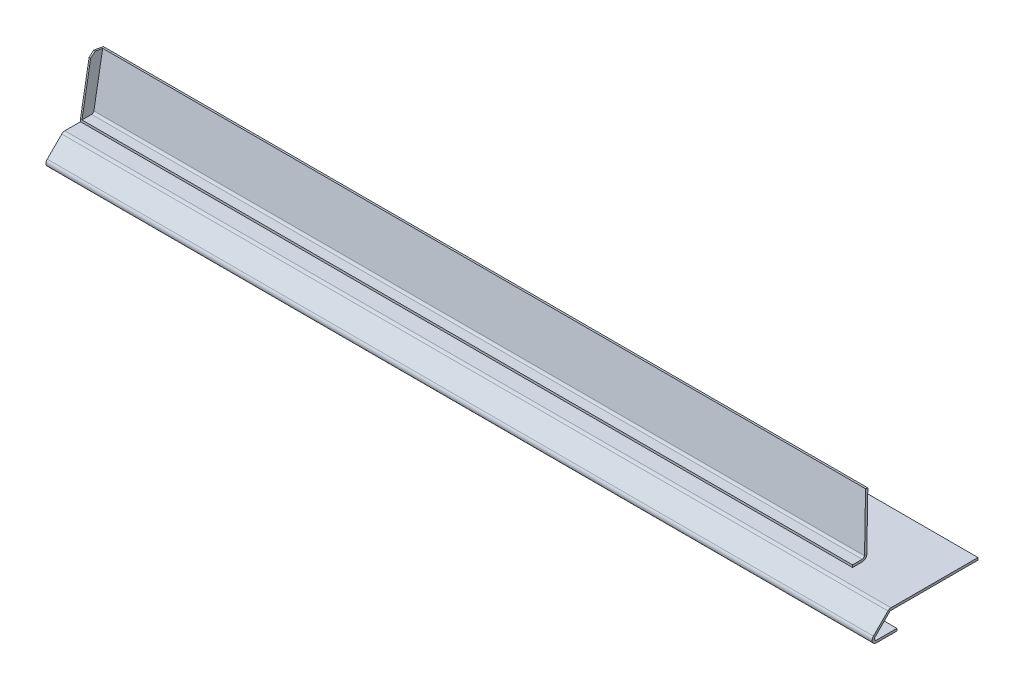
ISO-10303-21;
HEADER;
FILE_DESCRIPTION(('STEP AP214'),'2;1');
FILE_NAME('part.step','',(''),(''),'','','');
FILE_SCHEMA(('AUTOMOTIVE_DESIGN { 1 0 10303 214 1 1 1 1 }'));
ENDSEC;
DATA;
#1=APPLICATION_CONTEXT('core data for automotive mechanical design processes');
#2=APPLICATION_PROTOCOL_DEFINITION('international standard','automotive_design',2000,#1);
#3=PRODUCT_CONTEXT('',#1,'mechanical');
#4=PRODUCT('Part','Part','',(#3));
#5=PRODUCT_RELATED_PRODUCT_CATEGORY('part','',(#4));
#6=PRODUCT_DEFINITION_FORMATION('','',#4);
#7=PRODUCT_DEFINITION_CONTEXT('part definition',#1,'design');
#8=PRODUCT_DEFINITION('design','',#6,#7);
#9=PRODUCT_DEFINITION_SHAPE('','',#8);
#10=(LENGTH_UNIT() NAMED_UNIT(*) SI_UNIT(.MILLI.,.METRE.));
#11=(NAMED_UNIT(*) PLANE_ANGLE_UNIT() SI_UNIT($,.RADIAN.));
#12=(NAMED_UNIT(*) SI_UNIT($,.STERADIAN.) SOLID_ANGLE_UNIT());
#13=UNCERTAINTY_MEASURE_WITH_UNIT(LENGTH_MEASURE(1.E-05),#10,'distance_accuracy_value','');
#14=(GEOMETRIC_REPRESENTATION_CONTEXT(3) GLOBAL_UNCERTAINTY_ASSIGNED_CONTEXT((#13)) GLOBAL_UNIT_ASSIGNED_CONTEXT((#10,
#11,#12)) REPRESENTATION_CONTEXT('',''));
#15=CARTESIAN_POINT('',(0.,0.,0.));
#16=DIRECTION('',(0.,0.,1.));
#17=DIRECTION('',(1.,0.,0.));
#18=AXIS2_PLACEMENT_3D('',#15,#16,#17);
#19=CARTESIAN_POINT('',(-475.,146.5,-26.6));
#20=DIRECTION('',(1.,0.,0.));
#21=DIRECTION('',(0.,0.,1.));
#22=AXIS2_PLACEMENT_3D('',#19,#20,#21);
#23=PLANE('',#22);
#24=DIRECTION('',(0.,-0.984807753012213,0.173648177666903));
#25=VECTOR('',#24,1.);
#26=CARTESIAN_POINT('',(-475.,-824.0540173282,410.745576741));
#27=LINE('',#26,#25);
#28=CARTESIAN_POINT('',(-475.,-824.0540173282,410.745576741));
#29=VERTEX_POINT('',#28);
#30=CARTESIAN_POINT('',(-475.,-888.541889066,422.1165284568));
#31=VERTEX_POINT('',#30);
#32=EDGE_CURVE('E11',#29,#31,#27,.T.);
#33=ORIENTED_EDGE('',*,*,#32,.T.);
#34=CARTESIAN_POINT('',(-475.,-887.5,428.0253749749));
#35=DIRECTION('',(-1.,0.,0.));
#36=DIRECTION('',(0.,-0.173648177666903,-0.984807753012213));
#37=AXIS2_PLACEMENT_3D('',#34,#35,#36);
#38=CIRCLE('',#37,6.);
#39=CARTESIAN_POINT('',(-475.,-893.5,428.0253749749));
#40=VERTEX_POINT('',#39);
#41=EDGE_CURVE('E26',#31,#40,#38,.T.);
#42=ORIENTED_EDGE('',*,*,#41,.T.);
#43=DIRECTION('',(0.,0.,1.));
#44=VECTOR('',#43,1.);
#45=CARTESIAN_POINT('',(-475.,-893.5,348.045));
#46=LINE('',#45,#44);
#47=CARTESIAN_POINT('',(-475.,-893.5,348.045));
#48=VERTEX_POINT('',#47);
#49=EDGE_CURVE('E199',#48,#40,#46,.T.);
#50=ORIENTED_EDGE('',*,*,#49,.F.);
#51=DIRECTION('',(0.,-1.,0.));
#52=VECTOR('',#51,1.);
#53=CARTESIAN_POINT('',(-475.,-893.5,348.045));
#54=LINE('',#53,#52);
#55=CARTESIAN_POINT('',(-475.,-923.5,348.045));
#56=VERTEX_POINT('',#55);
#57=EDGE_CURVE('E235',#48,#56,#54,.T.);
#58=ORIENTED_EDGE('',*,*,#57,.T.);
#59=DIRECTION('',(0.,0.,1.));
#60=VECTOR('',#59,1.);
#61=CARTESIAN_POINT('',(-475.,-923.5,348.045));
#62=LINE('',#61,#60);
#63=CARTESIAN_POINT('',(-475.,-923.5,479.5253087613));
#64=VERTEX_POINT('',#63);
#65=EDGE_CURVE('E271',#56,#64,#62,.T.);
#66=ORIENTED_EDGE('',*,*,#65,.T.);
#67=CARTESIAN_POINT('',(-475.,-917.9,479.5253087613));
#68=DIRECTION('',(1.,0.,0.));
#69=DIRECTION('',(0.,0.707106781186598,0.707106781186498));
#70=AXIS2_PLACEMENT_3D('',#67,#68,#69);
#71=CIRCLE('',#70,5.6);
#72=CARTESIAN_POINT('',(-475.,-913.940202025,483.485106736));
#73=VERTEX_POINT('',#72);
#74=EDGE_CURVE('E261',#73,#64,#71,.T.);
#75=ORIENTED_EDGE('',*,*,#74,.F.);
#76=DIRECTION('',(0.,-0.707106781186498,0.707106781186598));
#77=VECTOR('',#76,1.);
#78=CARTESIAN_POINT('',(-475.,-895.140202025,464.685106736));
#79=LINE('',#78,#77);
#80=CARTESIAN_POINT('',(-475.,-895.140202025,464.685106736));
#81=VERTEX_POINT('',#80);
#82=EDGE_CURVE('E265',#81,#73,#79,.T.);
#83=ORIENTED_EDGE('',*,*,#82,.F.);
#84=CARTESIAN_POINT('',(-475.,-899.1,460.7253087613));
#85=DIRECTION('',(1.,0.,0.));
#86=DIRECTION('',(0.,1.,0.));
#87=AXIS2_PLACEMENT_3D('',#84,#85,#86);
#88=CIRCLE('',#87,5.6);
#89=CARTESIAN_POINT('',(-475.,-893.5,460.7253087613));
#90=VERTEX_POINT('',#89);
#91=EDGE_CURVE('E227',#90,#81,#88,.T.);
#92=ORIENTED_EDGE('',*,*,#91,.F.);
#93=DIRECTION('',(0.,0.,1.));
#94=VECTOR('',#93,1.);
#95=CARTESIAN_POINT('',(-475.,-893.5,440.5080760814));
#96=LINE('',#95,#94);
#97=CARTESIAN_POINT('',(-475.,-893.5,440.5080760814));
#98=VERTEX_POINT('',#97);
#99=EDGE_CURVE('E198',#98,#90,#96,.T.);
#100=ORIENTED_EDGE('',*,*,#99,.F.);
#101=DIRECTION('',(0.,1.,0.));
#102=VECTOR('',#101,1.);
#103=CARTESIAN_POINT('',(-475.,-893.5,440.5080760814));
#104=LINE('',#103,#102);
#105=CARTESIAN_POINT('',(-475.,-890.5,440.5080760814));
#106=VERTEX_POINT('',#105);
#107=EDGE_CURVE('E268',#98,#106,#104,.T.);
#108=ORIENTED_EDGE('',*,*,#107,.T.);
#109=DIRECTION('',(0.,0.984807753012213,-0.173648177666903));
#110=VECTOR('',#109,1.);
#111=CARTESIAN_POINT('',(-475.,-890.5,440.5080760814));
#112=LINE('',#111,#110);
#113=CARTESIAN_POINT('',(-475.,-826.8361626086,429.2824238538));
#114=VERTEX_POINT('',#113);
#115=EDGE_CURVE('E272',#106,#114,#112,.T.);
#116=ORIENTED_EDGE('',*,*,#115,.T.);
#117=DIRECTION('',(0.,0.642787609686505,-0.766044443119007));
#118=VECTOR('',#117,1.);
#119=CARTESIAN_POINT('',(-475.,-826.8361626086,429.2824238538));
#120=LINE('',#119,#118);
#121=CARTESIAN_POINT('',(-475.,-821.8361626086,423.3236558908));
#122=VERTEX_POINT('',#121);
#123=EDGE_CURVE('E219',#114,#122,#120,.T.);
#124=ORIENTED_EDGE('',*,*,#123,.T.);
#125=DIRECTION('',(0.,-0.173648177666999,-0.984807753012196));
#126=VECTOR('',#125,1.);
#127=CARTESIAN_POINT('',(-475.,-821.8361626086,423.3236558908));
#128=LINE('',#127,#126);
#129=EDGE_CURVE('E217',#122,#29,#128,.T.);
#130=ORIENTED_EDGE('',*,*,#129,.T.);
#131=EDGE_LOOP('',(#33,#42,#50,#58,#66,#75,#83,#92,#100,#108,#116,#124,#130));
#132=FACE_BOUND('',#131,.T.);
#133=ADVANCED_FACE('F17',(#132),#23,.F.);
#134=CARTESIAN_POINT('',(-475.,-823.5330727952,413.7));
#135=DIRECTION('',(0.,0.984807753012213,-0.173648177666903));
#136=DIRECTION('',(0.,-0.173648177666903,-0.984807753012213));
#137=AXIS2_PLACEMENT_3D('',#134,#135,#136);
#138=PLANE('',#137);
#139=DIRECTION('',(-1.,0.,0.));
#140=VECTOR('',#139,1.);
#141=CARTESIAN_POINT('',(515.,-824.0540173282,410.745576741));
#142=LINE('',#141,#140);
#143=CARTESIAN_POINT('',(515.,-824.0540173282,410.745576741));
#144=VERTEX_POINT('',#143);
#145=EDGE_CURVE('E185',#144,#29,#142,.T.);
#146=ORIENTED_EDGE('',*,*,#145,.T.);
#147=ORIENTED_EDGE('',*,*,#129,.F.);
#148=DIRECTION('',(1.,0.,0.));
#149=VECTOR('',#148,1.);
#150=CARTESIAN_POINT('',(-475.,-821.8361626086,423.3236558908));
#151=LINE('',#150,#149);
#152=CARTESIAN_POINT('',(-473.,-821.8361626086,423.3236558908));
#153=VERTEX_POINT('',#152);
#154=EDGE_CURVE('E182',#122,#153,#151,.T.);
#155=ORIENTED_EDGE('',*,*,#154,.T.);
#156=DIRECTION('',(0.,-0.173648177666903,-0.984807753012213));
#157=VECTOR('',#156,1.);
#158=CARTESIAN_POINT('',(-473.,-821.8361626086,423.3236558908));
#159=LINE('',#158,#157);
#160=CARTESIAN_POINT('',(-473.,-823.5330727952,413.7));
#161=VERTEX_POINT('',#160);
#162=EDGE_CURVE('E186',#153,#161,#159,.T.);
#163=ORIENTED_EDGE('',*,*,#162,.T.);
#164=DIRECTION('',(-1.,0.,0.));
#165=VECTOR('',#164,1.);
#166=CARTESIAN_POINT('',(515.,-823.5330727952,413.7));
#167=LINE('',#166,#165);
#168=CARTESIAN_POINT('',(515.,-823.5330727952,413.7));
#169=VERTEX_POINT('',#168);
#170=EDGE_CURVE('E163',#169,#161,#167,.T.);
#171=ORIENTED_EDGE('',*,*,#170,.F.);
#172=DIRECTION('',(0.,0.173648177666999,0.984807753012196));
#173=VECTOR('',#172,1.);
#174=CARTESIAN_POINT('',(515.,-824.0540173282,410.745576741));
#175=LINE('',#174,#173);
#176=EDGE_CURVE('E290',#144,#169,#175,.T.);
#177=ORIENTED_EDGE('',*,*,#176,.F.);
#178=EDGE_LOOP('',(#146,#147,#155,#163,#171,#177));
#179=FACE_BOUND('',#178,.T.);
#180=ADVANCED_FACE('F455',(#179),#138,.T.);
#181=CARTESIAN_POINT('',(515.,-823.5330727952,413.7));
#182=DIRECTION('',(-0.988371697650615,-0.149747093954502,0.0264044529468604));
#183=DIRECTION('',(0.0267055761141512,0.,0.999643342499919));
#184=AXIS2_PLACEMENT_3D('',#181,#182,#183);
#185=PLANE('',#184);
#186=DIRECTION('',(0.152057184253896,-0.973356110704174,0.171628944154596));
#187=VECTOR('',#186,1.);
#188=CARTESIAN_POINT('',(515.,-824.0540173282,410.745576741));
#189=LINE('',#188,#187);
#190=CARTESIAN_POINT('',(525.,-888.066521274,422.0327082893));
#191=VERTEX_POINT('',#190);
#192=EDGE_CURVE('E210',#144,#191,#189,.T.);
#193=ORIENTED_EDGE('',*,*,#192,.F.);
#194=ORIENTED_EDGE('',*,*,#176,.T.);
#195=DIRECTION('',(0.152057184253896,-0.973356110704174,0.171628944154596));
#196=VECTOR('',#195,1.);
#197=CARTESIAN_POINT('',(515.,-823.5330727952,413.7));
#198=LINE('',#197,#196);
#199=CARTESIAN_POINT('',(525.,-887.545576741,424.9871315484));
#200=VERTEX_POINT('',#199);
#201=EDGE_CURVE('E287',#169,#200,#198,.T.);
#202=ORIENTED_EDGE('',*,*,#201,.T.);
#203=DIRECTION('',(0.,0.173648177666999,0.984807753012196));
#204=VECTOR('',#203,1.);
#205=CARTESIAN_POINT('',(525.,-888.066521274,422.0327082893));
#206=LINE('',#205,#204);
#207=EDGE_CURVE('E233',#191,#200,#206,.T.);
#208=ORIENTED_EDGE('',*,*,#207,.F.);
#209=EDGE_LOOP('',(#193,#194,#202,#208));
#210=FACE_BOUND('',#209,.T.);
#211=ADVANCED_FACE('F459',(#210),#185,.F.);
#212=CARTESIAN_POINT('',(525.,146.5,-26.6));
#213=DIRECTION('',(-1.,0.,0.));
#214=DIRECTION('',(0.,-1.,0.));
#215=AXIS2_PLACEMENT_3D('',#212,#213,#214);
#216=PLANE('',#215);
#217=DIRECTION('',(0.,-0.98480775301223,0.173648177666806));
#218=VECTOR('',#217,1.);
#219=CARTESIAN_POINT('',(525.,-887.545576741,424.9871315484));
#220=LINE('',#219,#218);
#221=CARTESIAN_POINT('',(525.,-888.020944533,425.0709517158));
#222=VERTEX_POINT('',#221);
#223=EDGE_CURVE('E291',#200,#222,#220,.T.);
#224=ORIENTED_EDGE('',*,*,#223,.T.);
#225=CARTESIAN_POINT('',(525.,-887.5,428.0253749749));
#226=DIRECTION('',(1.,0.,0.));
#227=DIRECTION('',(0.,-1.,0.));
#228=AXIS2_PLACEMENT_3D('',#225,#226,#227);
#229=CIRCLE('',#228,3.);
#230=CARTESIAN_POINT('',(525.,-890.5,428.0253749749));
#231=VERTEX_POINT('',#230);
#232=EDGE_CURVE('E138',#231,#222,#229,.T.);
#233=ORIENTED_EDGE('',*,*,#232,.F.);
#234=DIRECTION('',(0.,0.,1.));
#235=VECTOR('',#234,1.);
#236=CARTESIAN_POINT('',(525.,-890.5,428.0253749749));
#237=LINE('',#236,#235);
#238=CARTESIAN_POINT('',(525.,-890.5,440.5080760814));
#239=VERTEX_POINT('',#238);
#240=EDGE_CURVE('E232',#231,#239,#237,.T.);
#241=ORIENTED_EDGE('',*,*,#240,.T.);
#242=DIRECTION('',(0.,1.,0.));
#243=VECTOR('',#242,1.);
#244=CARTESIAN_POINT('',(525.,-893.5,440.5080760814));
#245=LINE('',#244,#243);
#246=CARTESIAN_POINT('',(525.,-893.5,440.5080760814));
#247=VERTEX_POINT('',#246);
#248=EDGE_CURVE('E228',#247,#239,#245,.T.);
#249=ORIENTED_EDGE('',*,*,#248,.F.);
#250=DIRECTION('',(0.,0.,1.));
#251=VECTOR('',#250,1.);
#252=CARTESIAN_POINT('',(525.,-893.5,428.0253749749));
#253=LINE('',#252,#251);
#254=CARTESIAN_POINT('',(525.,-893.5,428.0253749749));
#255=VERTEX_POINT('',#254);
#256=EDGE_CURVE('E241',#255,#247,#253,.T.);
#257=ORIENTED_EDGE('',*,*,#256,.F.);
#258=CARTESIAN_POINT('',(525.,-887.5,428.0253749749));
#259=DIRECTION('',(-1.,0.,0.));
#260=DIRECTION('',(0.,-0.173648177666903,-0.984807753012213));
#261=AXIS2_PLACEMENT_3D('',#258,#259,#260);
#262=CIRCLE('',#261,6.);
#263=CARTESIAN_POINT('',(525.,-888.541889066,422.1165284568));
#264=VERTEX_POINT('',#263);
#265=EDGE_CURVE('E211',#264,#255,#262,.T.);
#266=ORIENTED_EDGE('',*,*,#265,.F.);
#267=DIRECTION('',(0.,0.98480775301223,-0.173648177666806));
#268=VECTOR('',#267,1.);
#269=CARTESIAN_POINT('',(525.,-888.541889066,422.1165284568));
#270=LINE('',#269,#268);
#271=EDGE_CURVE('E229',#264,#191,#270,.T.);
#272=ORIENTED_EDGE('',*,*,#271,.T.);
#273=ORIENTED_EDGE('',*,*,#207,.T.);
#274=EDGE_LOOP('',(#224,#233,#241,#249,#257,#266,#272,#273));
#275=FACE_BOUND('',#274,.T.);
#276=ADVANCED_FACE('F419',(#275),#216,.F.);
#277=CARTESIAN_POINT('',(-475.,-824.0540173282,410.745576741));
#278=DIRECTION('',(0.,-0.173648177666903,-0.984807753012213));
#279=DIRECTION('',(-1.,0.,0.));
#280=AXIS2_PLACEMENT_3D('',#277,#278,#279);
#281=PLANE('',#280);
#282=ORIENTED_EDGE('',*,*,#271,.F.);
#283=DIRECTION('',(1.,0.,0.));
#284=VECTOR('',#283,1.);
#285=CARTESIAN_POINT('',(-475.,-888.541889066,422.1165284568));
#286=LINE('',#285,#284);
#287=EDGE_CURVE('E208',#31,#264,#286,.T.);
#288=ORIENTED_EDGE('',*,*,#287,.F.);
#289=ORIENTED_EDGE('',*,*,#32,.F.);
#290=ORIENTED_EDGE('',*,*,#145,.F.);
#291=ORIENTED_EDGE('',*,*,#192,.T.);
#292=EDGE_LOOP('',(#282,#288,#289,#290,#291));
#293=FACE_BOUND('',#292,.T.);
#294=ADVANCED_FACE('F470',(#293),#281,.T.);
#295=CARTESIAN_POINT('',(-475.,-887.5,428.0253749749));
#296=DIRECTION('',(-1.,0.,0.));
#297=DIRECTION('',(0.,-1.,0.));
#298=AXIS2_PLACEMENT_3D('',#295,#296,#297);
#299=CYLINDRICAL_SURFACE('',#298,6.);
#300=ORIENTED_EDGE('',*,*,#41,.F.);
#301=ORIENTED_EDGE('',*,*,#287,.T.);
#302=ORIENTED_EDGE('',*,*,#265,.T.);
#303=DIRECTION('',(-1.,0.,0.));
#304=VECTOR('',#303,1.);
#305=CARTESIAN_POINT('',(525.,-893.5,428.0253749749));
#306=LINE('',#305,#304);
#307=EDGE_CURVE('E404',#255,#40,#306,.T.);
#308=ORIENTED_EDGE('',*,*,#307,.T.);
#309=EDGE_LOOP('',(#300,#301,#302,#308));
#310=FACE_BOUND('',#309,.T.);
#311=ADVANCED_FACE('F472',(#310),#299,.T.);
#312=CARTESIAN_POINT('',(-475.,-893.5,305.3645006599));
#313=DIRECTION('',(0.,1.,0.));
#314=DIRECTION('',(0.,0.,-1.));
#315=AXIS2_PLACEMENT_3D('',#312,#313,#314);
#316=PLANE('',#315);
#317=ORIENTED_EDGE('',*,*,#307,.F.);
#318=ORIENTED_EDGE('',*,*,#256,.T.);
#319=DIRECTION('',(1.,0.,0.));
#320=VECTOR('',#319,1.);
#321=CARTESIAN_POINT('',(-475.,-893.5,440.5080760814));
#322=LINE('',#321,#320);
#323=EDGE_CURVE('E224',#98,#247,#322,.T.);
#324=ORIENTED_EDGE('',*,*,#323,.F.);
#325=ORIENTED_EDGE('',*,*,#99,.T.);
#326=DIRECTION('',(1.,0.,0.));
#327=VECTOR('',#326,1.);
#328=CARTESIAN_POINT('',(-475.,-893.5,460.7253087613));
#329=LINE('',#328,#327);
#330=CARTESIAN_POINT('',(595.,-893.5,460.7253087613));
#331=VERTEX_POINT('',#330);
#332=EDGE_CURVE('E195',#90,#331,#329,.T.);
#333=ORIENTED_EDGE('',*,*,#332,.T.);
#334=DIRECTION('',(0.,0.,1.));
#335=VECTOR('',#334,1.);
#336=CARTESIAN_POINT('',(595.,-893.5,348.045));
#337=LINE('',#336,#335);
#338=CARTESIAN_POINT('',(595.,-893.5,348.045));
#339=VERTEX_POINT('',#338);
#340=EDGE_CURVE('E214',#339,#331,#337,.T.);
#341=ORIENTED_EDGE('',*,*,#340,.F.);
#342=DIRECTION('',(1.,0.,0.));
#343=VECTOR('',#342,1.);
#344=CARTESIAN_POINT('',(-475.,-893.5,348.045));
#345=LINE('',#344,#343);
#346=EDGE_CURVE('E276',#48,#339,#345,.T.);
#347=ORIENTED_EDGE('',*,*,#346,.F.);
#348=ORIENTED_EDGE('',*,*,#49,.T.);
#349=EDGE_LOOP('',(#317,#318,#324,#325,#333,#341,#347,#348));
#350=FACE_BOUND('',#349,.T.);
#351=ADVANCED_FACE('F424',(#350),#316,.T.);
#352=CARTESIAN_POINT('',(-475.,146.5,348.045));
#353=DIRECTION('',(0.,0.,1.));
#354=DIRECTION('',(1.,0.,0.));
#355=AXIS2_PLACEMENT_3D('',#352,#353,#354);
#356=PLANE('',#355);
#357=ORIENTED_EDGE('',*,*,#346,.T.);
#358=DIRECTION('',(0.,1.,0.));
#359=VECTOR('',#358,1.);
#360=CARTESIAN_POINT('',(595.,-896.5,348.045));
#361=LINE('',#360,#359);
#362=CARTESIAN_POINT('',(595.,-896.5,348.045));
#363=VERTEX_POINT('',#362);
#364=EDGE_CURVE('E307',#363,#339,#361,.T.);
#365=ORIENTED_EDGE('',*,*,#364,.F.);
#366=DIRECTION('',(1.,0.,0.));
#367=VECTOR('',#366,1.);
#368=CARTESIAN_POINT('',(-473.,-896.5,348.045));
#369=LINE('',#368,#367);
#370=CARTESIAN_POINT('',(-473.,-896.5,348.045));
#371=VERTEX_POINT('',#370);
#372=EDGE_CURVE('E304',#371,#363,#369,.T.);
#373=ORIENTED_EDGE('',*,*,#372,.F.);
#374=DIRECTION('',(0.,-1.,0.));
#375=VECTOR('',#374,1.);
#376=CARTESIAN_POINT('',(-473.,-896.5,348.045));
#377=LINE('',#376,#375);
#378=CARTESIAN_POINT('',(-473.,-923.5,348.045));
#379=VERTEX_POINT('',#378);
#380=EDGE_CURVE('E273',#371,#379,#377,.T.);
#381=ORIENTED_EDGE('',*,*,#380,.T.);
#382=DIRECTION('',(1.,0.,0.));
#383=VECTOR('',#382,1.);
#384=CARTESIAN_POINT('',(-475.,-923.5,348.045));
#385=LINE('',#384,#383);
#386=EDGE_CURVE('E251',#56,#379,#385,.T.);
#387=ORIENTED_EDGE('',*,*,#386,.F.);
#388=ORIENTED_EDGE('',*,*,#57,.F.);
#389=EDGE_LOOP('',(#357,#365,#373,#381,#387,#388));
#390=FACE_BOUND('',#389,.T.);
#391=ADVANCED_FACE('F344',(#390),#356,.F.);
#392=CARTESIAN_POINT('',(-475.,-923.5,479.5253087613));
#393=DIRECTION('',(0.,-1.,0.));
#394=DIRECTION('',(1.,0.,0.));
#395=AXIS2_PLACEMENT_3D('',#392,#393,#394);
#396=PLANE('',#395);
#397=DIRECTION('',(0.,0.,-1.));
#398=VECTOR('',#397,1.);
#399=CARTESIAN_POINT('',(595.,-923.5,479.5253087613));
#400=LINE('',#399,#398);
#401=CARTESIAN_POINT('',(595.,-923.5,479.5253087613));
#402=VERTEX_POINT('',#401);
#403=CARTESIAN_POINT('',(595.,-923.5,453.0449047106));
#404=VERTEX_POINT('',#403);
#405=EDGE_CURVE('E207',#402,#404,#400,.T.);
#406=ORIENTED_EDGE('',*,*,#405,.F.);
#407=DIRECTION('',(1.,0.,0.));
#408=VECTOR('',#407,1.);
#409=CARTESIAN_POINT('',(-475.,-923.5,479.5253087613));
#410=LINE('',#409,#408);
#411=EDGE_CURVE('E263',#64,#402,#410,.T.);
#412=ORIENTED_EDGE('',*,*,#411,.F.);
#413=ORIENTED_EDGE('',*,*,#65,.F.);
#414=ORIENTED_EDGE('',*,*,#386,.T.);
#415=DIRECTION('',(0.,0.,1.));
#416=VECTOR('',#415,1.);
#417=CARTESIAN_POINT('',(-473.,-923.5,348.045));
#418=LINE('',#417,#416);
#419=CARTESIAN_POINT('',(-473.,-923.5,453.0449047106));
#420=VERTEX_POINT('',#419);
#421=EDGE_CURVE('E248',#379,#420,#418,.T.);
#422=ORIENTED_EDGE('',*,*,#421,.T.);
#423=DIRECTION('',(1.,0.,0.));
#424=VECTOR('',#423,1.);
#425=CARTESIAN_POINT('',(-473.,-923.5,453.0449047106));
#426=LINE('',#425,#424);
#427=EDGE_CURVE('E238',#420,#404,#426,.T.);
#428=ORIENTED_EDGE('',*,*,#427,.T.);
#429=EDGE_LOOP('',(#406,#412,#413,#414,#422,#428));
#430=FACE_BOUND('',#429,.T.);
#431=ADVANCED_FACE('F349',(#430),#396,.T.);
#432=CARTESIAN_POINT('',(-475.,-923.5,453.0449047106));
#433=DIRECTION('',(0.,0.,-1.));
#434=DIRECTION('',(0.,1.,0.));
#435=AXIS2_PLACEMENT_3D('',#432,#433,#434);
#436=PLANE('',#435);
#437=DIRECTION('',(1.,0.,0.));
#438=VECTOR('',#437,1.);
#439=CARTESIAN_POINT('',(-473.,-920.5,453.0449047106));
#440=LINE('',#439,#438);
#441=CARTESIAN_POINT('',(-473.,-920.5,453.0449047106));
#442=VERTEX_POINT('',#441);
#443=CARTESIAN_POINT('',(595.,-920.5,453.0449047106));
#444=VERTEX_POINT('',#443);
#445=EDGE_CURVE('E223',#442,#444,#440,.T.);
#446=ORIENTED_EDGE('',*,*,#445,.T.);
#447=DIRECTION('',(0.,1.,0.));
#448=VECTOR('',#447,1.);
#449=CARTESIAN_POINT('',(595.,-923.5,453.0449047106));
#450=LINE('',#449,#448);
#451=EDGE_CURVE('E284',#404,#444,#450,.T.);
#452=ORIENTED_EDGE('',*,*,#451,.F.);
#453=ORIENTED_EDGE('',*,*,#427,.F.);
#454=DIRECTION('',(0.,1.,0.));
#455=VECTOR('',#454,1.);
#456=CARTESIAN_POINT('',(-473.,-923.5,453.0449047106));
#457=LINE('',#456,#455);
#458=EDGE_CURVE('E220',#420,#442,#457,.T.);
#459=ORIENTED_EDGE('',*,*,#458,.T.);
#460=EDGE_LOOP('',(#446,#452,#453,#459));
#461=FACE_BOUND('',#460,.T.);
#462=ADVANCED_FACE('F374',(#461),#436,.T.);
#463=CARTESIAN_POINT('',(-473.,146.5,-26.6));
#464=DIRECTION('',(-1.,0.,0.));
#465=DIRECTION('',(0.,-1.,0.));
#466=AXIS2_PLACEMENT_3D('',#463,#464,#465);
#467=PLANE('',#466);
#468=DIRECTION('',(0.,0.,1.));
#469=VECTOR('',#468,1.);
#470=CARTESIAN_POINT('',(-473.,-920.5,453.0449047106));
#471=LINE('',#470,#469);
#472=CARTESIAN_POINT('',(-473.,-920.5,479.5253087613));
#473=VERTEX_POINT('',#472);
#474=EDGE_CURVE('E194',#442,#473,#471,.T.);
#475=ORIENTED_EDGE('',*,*,#474,.F.);
#476=ORIENTED_EDGE('',*,*,#458,.F.);
#477=ORIENTED_EDGE('',*,*,#421,.F.);
#478=ORIENTED_EDGE('',*,*,#380,.F.);
#479=DIRECTION('',(0.,0.,-1.));
#480=VECTOR('',#479,1.);
#481=CARTESIAN_POINT('',(-473.,-896.5,460.7253087613));
#482=LINE('',#481,#480);
#483=CARTESIAN_POINT('',(-473.,-896.5,460.7253087613));
#484=VERTEX_POINT('',#483);
#485=EDGE_CURVE('E308',#484,#371,#482,.T.);
#486=ORIENTED_EDGE('',*,*,#485,.F.);
#487=CARTESIAN_POINT('',(-473.,-899.1,460.7253087613));
#488=DIRECTION('',(1.,0.,0.));
#489=DIRECTION('',(0.,1.,0.));
#490=AXIS2_PLACEMENT_3D('',#487,#488,#489);
#491=CIRCLE('',#490,2.6);
#492=CARTESIAN_POINT('',(-473.,-897.261522369,462.5637863924));
#493=VERTEX_POINT('',#492);
#494=EDGE_CURVE('E20',#484,#493,#491,.T.);
#495=ORIENTED_EDGE('',*,*,#494,.T.);
#496=DIRECTION('',(0.,0.707106781186498,-0.707106781186598));
#497=VECTOR('',#496,1.);
#498=CARTESIAN_POINT('',(-473.,-916.061522369,481.3637863924));
#499=LINE('',#498,#497);
#500=CARTESIAN_POINT('',(-473.,-916.061522369,481.3637863924));
#501=VERTEX_POINT('',#500);
#502=EDGE_CURVE('E392',#501,#493,#499,.T.);
#503=ORIENTED_EDGE('',*,*,#502,.F.);
#504=CARTESIAN_POINT('',(-473.,-917.9,479.5253087613));
#505=DIRECTION('',(1.,0.,0.));
#506=DIRECTION('',(0.,0.707106781187297,0.707106781185798));
#507=AXIS2_PLACEMENT_3D('',#504,#505,#506);
#508=CIRCLE('',#507,2.6);
#509=EDGE_CURVE('E190',#501,#473,#508,.T.);
#510=ORIENTED_EDGE('',*,*,#509,.T.);
#511=EDGE_LOOP('',(#475,#476,#477,#478,#486,#495,#503,#510));
#512=FACE_BOUND('',#511,.T.);
#513=ADVANCED_FACE('F440',(#512),#467,.F.);
#514=CARTESIAN_POINT('',(-475.,-917.9,479.5253087613));
#515=DIRECTION('',(1.,0.,0.));
#516=DIRECTION('',(0.,1.,0.));
#517=AXIS2_PLACEMENT_3D('',#514,#515,#516);
#518=CYLINDRICAL_SURFACE('',#517,2.6);
#519=DIRECTION('',(1.,0.,0.));
#520=VECTOR('',#519,1.);
#521=CARTESIAN_POINT('',(-473.,-916.061522369,481.3637863924));
#522=LINE('',#521,#520);
#523=CARTESIAN_POINT('',(595.,-916.061522369,481.3637863924));
#524=VERTEX_POINT('',#523);
#525=EDGE_CURVE('E187',#501,#524,#522,.T.);
#526=ORIENTED_EDGE('',*,*,#525,.T.);
#527=CARTESIAN_POINT('',(595.,-917.9,479.5253087613));
#528=DIRECTION('',(-1.,0.,0.));
#529=DIRECTION('',(0.,-1.,0.));
#530=AXIS2_PLACEMENT_3D('',#527,#528,#529);
#531=CIRCLE('',#530,2.6);
#532=CARTESIAN_POINT('',(595.,-920.5,479.5253087613));
#533=VERTEX_POINT('',#532);
#534=EDGE_CURVE('E254',#533,#524,#531,.T.);
#535=ORIENTED_EDGE('',*,*,#534,.F.);
#536=DIRECTION('',(1.,0.,0.));
#537=VECTOR('',#536,1.);
#538=CARTESIAN_POINT('',(-473.,-920.5,479.5253087613));
#539=LINE('',#538,#537);
#540=EDGE_CURVE('E191',#473,#533,#539,.T.);
#541=ORIENTED_EDGE('',*,*,#540,.F.);
#542=ORIENTED_EDGE('',*,*,#509,.F.);
#543=EDGE_LOOP('',(#526,#535,#541,#542));
#544=FACE_BOUND('',#543,.T.);
#545=ADVANCED_FACE('F387',(#544),#518,.F.);
#546=CARTESIAN_POINT('',(-475.,-920.5,453.0449047106));
#547=DIRECTION('',(0.,1.,0.));
#548=DIRECTION('',(0.,0.,-1.));
#549=AXIS2_PLACEMENT_3D('',#546,#547,#548);
#550=PLANE('',#549);
#551=ORIENTED_EDGE('',*,*,#540,.T.);
#552=DIRECTION('',(0.,0.,1.));
#553=VECTOR('',#552,1.);
#554=CARTESIAN_POINT('',(595.,-920.5,453.0449047106));
#555=LINE('',#554,#553);
#556=EDGE_CURVE('E281',#444,#533,#555,.T.);
#557=ORIENTED_EDGE('',*,*,#556,.F.);
#558=ORIENTED_EDGE('',*,*,#445,.F.);
#559=ORIENTED_EDGE('',*,*,#474,.T.);
#560=EDGE_LOOP('',(#551,#557,#558,#559));
#561=FACE_BOUND('',#560,.T.);
#562=ADVANCED_FACE('F379',(#561),#550,.T.);
#563=CARTESIAN_POINT('',(595.,146.5,-26.6));
#564=DIRECTION('',(1.,0.,0.));
#565=DIRECTION('',(0.,0.,1.));
#566=AXIS2_PLACEMENT_3D('',#563,#564,#565);
#567=PLANE('',#566);
#568=ORIENTED_EDGE('',*,*,#340,.T.);
#569=CARTESIAN_POINT('',(595.,-899.1,460.7253087613));
#570=DIRECTION('',(1.,0.,0.));
#571=DIRECTION('',(0.,1.,0.));
#572=AXIS2_PLACEMENT_3D('',#569,#570,#571);
#573=CIRCLE('',#572,5.6);
#574=CARTESIAN_POINT('',(595.,-895.140202025,464.685106736));
#575=VERTEX_POINT('',#574);
#576=EDGE_CURVE('E203',#331,#575,#573,.T.);
#577=ORIENTED_EDGE('',*,*,#576,.T.);
#578=DIRECTION('',(0.,-0.707106781186498,0.707106781186598));
#579=VECTOR('',#578,1.);
#580=CARTESIAN_POINT('',(595.,-895.140202025,464.685106736));
#581=LINE('',#580,#579);
#582=CARTESIAN_POINT('',(595.,-913.940202025,483.485106736));
#583=VERTEX_POINT('',#582);
#584=EDGE_CURVE('E200',#575,#583,#581,.T.);
#585=ORIENTED_EDGE('',*,*,#584,.T.);
#586=CARTESIAN_POINT('',(595.,-917.9,479.5253087613));
#587=DIRECTION('',(1.,0.,0.));
#588=DIRECTION('',(0.,0.707106781186598,0.707106781186498));
#589=AXIS2_PLACEMENT_3D('',#586,#587,#588);
#590=CIRCLE('',#589,5.6);
#591=EDGE_CURVE('E204',#583,#402,#590,.T.);
#592=ORIENTED_EDGE('',*,*,#591,.T.);
#593=ORIENTED_EDGE('',*,*,#405,.T.);
#594=ORIENTED_EDGE('',*,*,#451,.T.);
#595=ORIENTED_EDGE('',*,*,#556,.T.);
#596=ORIENTED_EDGE('',*,*,#534,.T.);
#597=DIRECTION('',(0.,0.707106781186548,-0.707106781186548));
#598=VECTOR('',#597,1.);
#599=CARTESIAN_POINT('',(595.,-916.061522369,481.3637863924));
#600=LINE('',#599,#598);
#601=CARTESIAN_POINT('',(595.,-897.261522369,462.5637863924));
#602=VERTEX_POINT('',#601);
#603=EDGE_CURVE('E245',#524,#602,#600,.T.);
#604=ORIENTED_EDGE('',*,*,#603,.T.);
#605=CARTESIAN_POINT('',(595.,-899.1,460.7253087613));
#606=DIRECTION('',(-1.,0.,0.));
#607=DIRECTION('',(0.,0.707106781186198,0.707106781186898));
#608=AXIS2_PLACEMENT_3D('',#605,#606,#607);
#609=CIRCLE('',#608,2.6);
#610=CARTESIAN_POINT('',(595.,-896.5,460.7253087613));
#611=VERTEX_POINT('',#610);
#612=EDGE_CURVE('E242',#602,#611,#609,.T.);
#613=ORIENTED_EDGE('',*,*,#612,.T.);
#614=DIRECTION('',(0.,0.,-1.));
#615=VECTOR('',#614,1.);
#616=CARTESIAN_POINT('',(595.,-896.5,460.7253087613));
#617=LINE('',#616,#615);
#618=EDGE_CURVE('E246',#611,#363,#617,.T.);
#619=ORIENTED_EDGE('',*,*,#618,.T.);
#620=ORIENTED_EDGE('',*,*,#364,.T.);
#621=EDGE_LOOP('',(#568,#577,#585,#592,#593,#594,#595,#596,#604,#613,#619,#620));
#622=FACE_BOUND('',#621,.T.);
#623=ADVANCED_FACE('F371',(#622),#567,.T.);
#624=CARTESIAN_POINT('',(-475.,-896.5,460.7253087613));
#625=DIRECTION('',(0.,-1.,0.));
#626=DIRECTION('',(1.,0.,0.));
#627=AXIS2_PLACEMENT_3D('',#624,#625,#626);
#628=PLANE('',#627);
#629=ORIENTED_EDGE('',*,*,#372,.T.);
#630=ORIENTED_EDGE('',*,*,#618,.F.);
#631=DIRECTION('',(1.,0.,0.));
#632=VECTOR('',#631,1.);
#633=CARTESIAN_POINT('',(-473.,-896.5,460.7253087613));
#634=LINE('',#633,#632);
#635=EDGE_CURVE('E332',#484,#611,#634,.T.);
#636=ORIENTED_EDGE('',*,*,#635,.F.);
#637=ORIENTED_EDGE('',*,*,#485,.T.);
#638=EDGE_LOOP('',(#629,#630,#636,#637));
#639=FACE_BOUND('',#638,.T.);
#640=ADVANCED_FACE('F438',(#639),#628,.T.);
#641=CARTESIAN_POINT('',(-475.,-899.1,460.7253087613));
#642=DIRECTION('',(1.,0.,0.));
#643=DIRECTION('',(0.,1.,0.));
#644=AXIS2_PLACEMENT_3D('',#641,#642,#643);
#645=CYLINDRICAL_SURFACE('',#644,2.6);
#646=ORIENTED_EDGE('',*,*,#635,.T.);
#647=ORIENTED_EDGE('',*,*,#612,.F.);
#648=DIRECTION('',(1.,0.,0.));
#649=VECTOR('',#648,1.);
#650=CARTESIAN_POINT('',(-473.,-897.261522369,462.5637863924));
#651=LINE('',#650,#649);
#652=EDGE_CURVE('E180',#493,#602,#651,.T.);
#653=ORIENTED_EDGE('',*,*,#652,.F.);
#654=ORIENTED_EDGE('',*,*,#494,.F.);
#655=EDGE_LOOP('',(#646,#647,#653,#654));
#656=FACE_BOUND('',#655,.T.);
#657=ADVANCED_FACE('F441',(#656),#645,.F.);
#658=CARTESIAN_POINT('',(-475.,-916.061522369,481.3637863924));
#659=DIRECTION('',(0.,-0.707106781186598,-0.707106781186498));
#660=DIRECTION('',(-1.,0.,0.));
#661=AXIS2_PLACEMENT_3D('',#658,#659,#660);
#662=PLANE('',#661);
#663=ORIENTED_EDGE('',*,*,#652,.T.);
#664=ORIENTED_EDGE('',*,*,#603,.F.);
#665=ORIENTED_EDGE('',*,*,#525,.F.);
#666=ORIENTED_EDGE('',*,*,#502,.T.);
#667=EDGE_LOOP('',(#663,#664,#665,#666));
#668=FACE_BOUND('',#667,.T.);
#669=ADVANCED_FACE('F390',(#668),#662,.T.);
#670=CARTESIAN_POINT('',(-475.,-917.9,479.5253087613));
#671=DIRECTION('',(1.,0.,0.));
#672=DIRECTION('',(0.,1.,0.));
#673=AXIS2_PLACEMENT_3D('',#670,#671,#672);
#674=CYLINDRICAL_SURFACE('',#673,5.6);
#675=ORIENTED_EDGE('',*,*,#411,.T.);
#676=ORIENTED_EDGE('',*,*,#591,.F.);
#677=DIRECTION('',(1.,0.,0.));
#678=VECTOR('',#677,1.);
#679=CARTESIAN_POINT('',(-475.,-913.940202025,483.485106736));
#680=LINE('',#679,#678);
#681=EDGE_CURVE('E264',#73,#583,#680,.T.);
#682=ORIENTED_EDGE('',*,*,#681,.F.);
#683=ORIENTED_EDGE('',*,*,#74,.T.);
#684=EDGE_LOOP('',(#675,#676,#682,#683));
#685=FACE_BOUND('',#684,.T.);
#686=ADVANCED_FACE('F449',(#685),#674,.T.);
#687=CARTESIAN_POINT('',(-475.,-895.140202025,464.685106736));
#688=DIRECTION('',(0.,0.707106781186598,0.707106781186498));
#689=DIRECTION('',(-1.,0.,0.));
#690=AXIS2_PLACEMENT_3D('',#687,#688,#689);
#691=PLANE('',#690);
#692=ORIENTED_EDGE('',*,*,#681,.T.);
#693=ORIENTED_EDGE('',*,*,#584,.F.);
#694=DIRECTION('',(1.,0.,0.));
#695=VECTOR('',#694,1.);
#696=CARTESIAN_POINT('',(-475.,-895.140202025,464.685106736));
#697=LINE('',#696,#695);
#698=EDGE_CURVE('E267',#81,#575,#697,.T.);
#699=ORIENTED_EDGE('',*,*,#698,.F.);
#700=ORIENTED_EDGE('',*,*,#82,.T.);
#701=EDGE_LOOP('',(#692,#693,#699,#700));
#702=FACE_BOUND('',#701,.T.);
#703=ADVANCED_FACE('F469',(#702),#691,.T.);
#704=CARTESIAN_POINT('',(-475.,-899.1,460.7253087613));
#705=DIRECTION('',(1.,0.,0.));
#706=DIRECTION('',(0.,1.,0.));
#707=AXIS2_PLACEMENT_3D('',#704,#705,#706);
#708=CYLINDRICAL_SURFACE('',#707,5.6);
#709=ORIENTED_EDGE('',*,*,#698,.T.);
#710=ORIENTED_EDGE('',*,*,#576,.F.);
#711=ORIENTED_EDGE('',*,*,#332,.F.);
#712=ORIENTED_EDGE('',*,*,#91,.T.);
#713=EDGE_LOOP('',(#709,#710,#711,#712));
#714=FACE_BOUND('',#713,.T.);
#715=ADVANCED_FACE('F432',(#714),#708,.T.);
#716=CARTESIAN_POINT('',(-475.,-893.5,440.5080760814));
#717=DIRECTION('',(0.,0.,1.));
#718=DIRECTION('',(1.,0.,0.));
#719=AXIS2_PLACEMENT_3D('',#716,#717,#718);
#720=PLANE('',#719);
#721=ORIENTED_EDGE('',*,*,#107,.F.);
#722=ORIENTED_EDGE('',*,*,#323,.T.);
#723=ORIENTED_EDGE('',*,*,#248,.T.);
#724=DIRECTION('',(-1.,0.,0.));
#725=VECTOR('',#724,1.);
#726=CARTESIAN_POINT('',(525.,-890.5,440.5080760814));
#727=LINE('',#726,#725);
#728=CARTESIAN_POINT('',(-473.,-890.5,440.5080760814));
#729=VERTEX_POINT('',#728);
#730=EDGE_CURVE('E259',#239,#729,#727,.T.);
#731=ORIENTED_EDGE('',*,*,#730,.T.);
#732=DIRECTION('',(1.,0.,0.));
#733=VECTOR('',#732,1.);
#734=CARTESIAN_POINT('',(-475.,-890.5,440.5080760814));
#735=LINE('',#734,#733);
#736=EDGE_CURVE('E260',#106,#729,#735,.T.);
#737=ORIENTED_EDGE('',*,*,#736,.F.);
#738=EDGE_LOOP('',(#721,#722,#723,#731,#737));
#739=FACE_BOUND('',#738,.T.);
#740=ADVANCED_FACE('F426',(#739),#720,.T.);
#741=CARTESIAN_POINT('',(-475.,-890.5,440.5080760814));
#742=DIRECTION('',(0.,0.173648177666903,0.984807753012213));
#743=DIRECTION('',(-1.,0.,0.));
#744=AXIS2_PLACEMENT_3D('',#741,#742,#743);
#745=PLANE('',#744);
#746=DIRECTION('',(0.,0.984807753012213,-0.173648177666903));
#747=VECTOR('',#746,1.);
#748=CARTESIAN_POINT('',(-473.,-890.5,440.5080760814));
#749=LINE('',#748,#747);
#750=CARTESIAN_POINT('',(-473.,-826.8361626086,429.2824238538));
#751=VERTEX_POINT('',#750);
#752=EDGE_CURVE('E256',#729,#751,#749,.T.);
#753=ORIENTED_EDGE('',*,*,#752,.T.);
#754=DIRECTION('',(1.,0.,0.));
#755=VECTOR('',#754,1.);
#756=CARTESIAN_POINT('',(-475.,-826.8361626086,429.2824238538));
#757=LINE('',#756,#755);
#758=EDGE_CURVE('E312',#114,#751,#757,.T.);
#759=ORIENTED_EDGE('',*,*,#758,.F.);
#760=ORIENTED_EDGE('',*,*,#115,.F.);
#761=ORIENTED_EDGE('',*,*,#736,.T.);
#762=EDGE_LOOP('',(#753,#759,#760,#761));
#763=FACE_BOUND('',#762,.T.);
#764=ADVANCED_FACE('F489',(#763),#745,.T.);
#765=CARTESIAN_POINT('',(-475.,-826.8361626086,429.2824238538));
#766=DIRECTION('',(0.,0.766044443119007,0.642787609686505));
#767=DIRECTION('',(-1.,0.,0.));
#768=AXIS2_PLACEMENT_3D('',#765,#766,#767);
#769=PLANE('',#768);
#770=ORIENTED_EDGE('',*,*,#758,.T.);
#771=DIRECTION('',(0.,0.642787609686505,-0.766044443119007));
#772=VECTOR('',#771,1.);
#773=CARTESIAN_POINT('',(-473.,-826.8361626086,429.2824238538));
#774=LINE('',#773,#772);
#775=EDGE_CURVE('E173',#751,#153,#774,.T.);
#776=ORIENTED_EDGE('',*,*,#775,.T.);
#777=ORIENTED_EDGE('',*,*,#154,.F.);
#778=ORIENTED_EDGE('',*,*,#123,.F.);
#779=EDGE_LOOP('',(#770,#776,#777,#778));
#780=FACE_BOUND('',#779,.T.);
#781=ADVANCED_FACE('F487',(#780),#769,.T.);
#782=CARTESIAN_POINT('',(-473.,146.5,-26.6));
#783=DIRECTION('',(-1.,0.,0.));
#784=DIRECTION('',(0.,-1.,0.));
#785=AXIS2_PLACEMENT_3D('',#782,#783,#784);
#786=PLANE('',#785);
#787=CARTESIAN_POINT('',(-473.,-887.5,428.0253749749));
#788=DIRECTION('',(-1.,0.,0.));
#789=DIRECTION('',(0.,-0.173648177666903,-0.984807753012213));
#790=AXIS2_PLACEMENT_3D('',#787,#788,#789);
#791=CIRCLE('',#790,3.);
#792=CARTESIAN_POINT('',(-473.,-888.020944533,425.0709517158));
#793=VERTEX_POINT('',#792);
#794=CARTESIAN_POINT('',(-473.,-890.5,428.0253749749));
#795=VERTEX_POINT('',#794);
#796=EDGE_CURVE('E152',#793,#795,#791,.T.);
#797=ORIENTED_EDGE('',*,*,#796,.F.);
#798=DIRECTION('',(0.,0.984807753012213,-0.173648177666903));
#799=VECTOR('',#798,1.);
#800=CARTESIAN_POINT('',(-473.,-888.020944533,425.0709517158));
#801=LINE('',#800,#799);
#802=EDGE_CURVE('E158',#793,#161,#801,.T.);
#803=ORIENTED_EDGE('',*,*,#802,.T.);
#804=ORIENTED_EDGE('',*,*,#162,.F.);
#805=ORIENTED_EDGE('',*,*,#775,.F.);
#806=ORIENTED_EDGE('',*,*,#752,.F.);
#807=DIRECTION('',(0.,0.,-1.));
#808=VECTOR('',#807,1.);
#809=CARTESIAN_POINT('',(-473.,-890.5,440.5080760814));
#810=LINE('',#809,#808);
#811=EDGE_CURVE('E161',#729,#795,#810,.T.);
#812=ORIENTED_EDGE('',*,*,#811,.T.);
#813=EDGE_LOOP('',(#797,#803,#804,#805,#806,#812));
#814=FACE_BOUND('',#813,.T.);
#815=ADVANCED_FACE('F157',(#814),#786,.F.);
#816=CARTESIAN_POINT('',(-475.,-890.5,440.5080760814));
#817=DIRECTION('',(0.,1.,0.));
#818=DIRECTION('',(0.,0.,-1.));
#819=AXIS2_PLACEMENT_3D('',#816,#817,#818);
#820=PLANE('',#819);
#821=ORIENTED_EDGE('',*,*,#730,.F.);
#822=ORIENTED_EDGE('',*,*,#240,.F.);
#823=DIRECTION('',(1.,0.,0.));
#824=VECTOR('',#823,1.);
#825=CARTESIAN_POINT('',(-473.,-890.5,428.0253749749));
#826=LINE('',#825,#824);
#827=EDGE_CURVE('E299',#795,#231,#826,.T.);
#828=ORIENTED_EDGE('',*,*,#827,.F.);
#829=ORIENTED_EDGE('',*,*,#811,.F.);
#830=EDGE_LOOP('',(#821,#822,#828,#829));
#831=FACE_BOUND('',#830,.T.);
#832=ADVANCED_FACE('F417',(#831),#820,.T.);
#833=CARTESIAN_POINT('',(-475.,-887.5,428.0253749749));
#834=DIRECTION('',(-1.,0.,0.));
#835=DIRECTION('',(0.,-1.,0.));
#836=AXIS2_PLACEMENT_3D('',#833,#834,#835);
#837=CYLINDRICAL_SURFACE('',#836,3.);
#838=ORIENTED_EDGE('',*,*,#827,.T.);
#839=ORIENTED_EDGE('',*,*,#232,.T.);
#840=DIRECTION('',(1.,0.,0.));
#841=VECTOR('',#840,1.);
#842=CARTESIAN_POINT('',(-473.,-888.020944533,425.0709517158));
#843=LINE('',#842,#841);
#844=EDGE_CURVE('E169',#793,#222,#843,.T.);
#845=ORIENTED_EDGE('',*,*,#844,.F.);
#846=ORIENTED_EDGE('',*,*,#796,.T.);
#847=EDGE_LOOP('',(#838,#839,#845,#846));
#848=FACE_BOUND('',#847,.T.);
#849=ADVANCED_FACE('F175',(#848),#837,.F.);
#850=CARTESIAN_POINT('',(-475.,-888.020944533,425.0709517158));
#851=DIRECTION('',(0.,0.173648177666903,0.984807753012213));
#852=DIRECTION('',(-1.,0.,0.));
#853=AXIS2_PLACEMENT_3D('',#850,#851,#852);
#854=PLANE('',#853);
#855=ORIENTED_EDGE('',*,*,#170,.T.);
#856=ORIENTED_EDGE('',*,*,#802,.F.);
#857=ORIENTED_EDGE('',*,*,#844,.T.);
#858=ORIENTED_EDGE('',*,*,#223,.F.);
#859=ORIENTED_EDGE('',*,*,#201,.F.);
#860=EDGE_LOOP('',(#855,#856,#857,#858,#859));
#861=FACE_BOUND('',#860,.T.);
#862=ADVANCED_FACE('F167',(#861),#854,.T.);
#863=CLOSED_SHELL('',(#133,#180,#211,#276,#294,#311,#351,#391,#431,#462,#513,#545,#562,#623,
#640,#657,#669,#686,#703,#715,#740,#764,#781,#815,#832,#849,#862));
#864=MANIFOLD_SOLID_BREP('B1',#863);
#865=ADVANCED_BREP_SHAPE_REPRESENTATION('',(#18,#864),#14);
#866=SHAPE_DEFINITION_REPRESENTATION(#9,#865);
ENDSEC;
END-ISO-10303-21;
